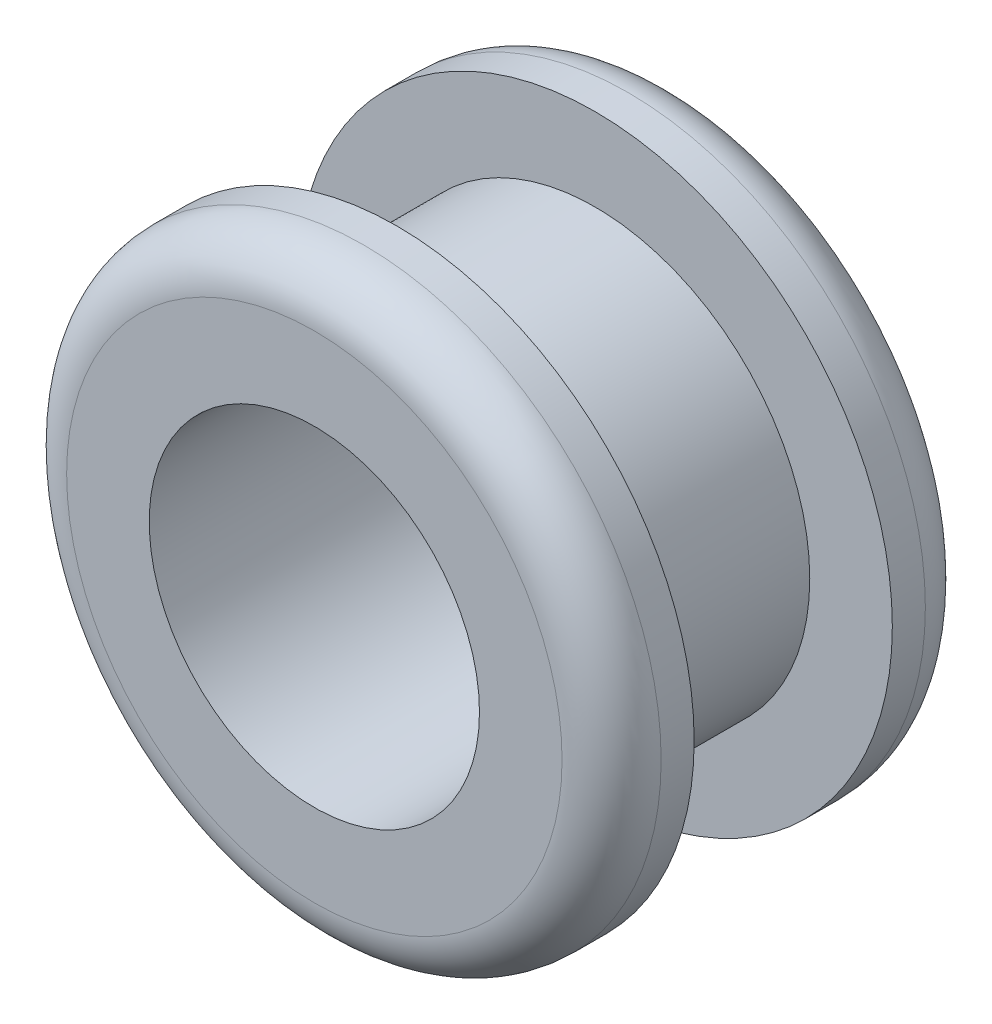
ISO-10303-21;
HEADER;
FILE_DESCRIPTION(('STEP AP214'),'2;1');
FILE_NAME('part.step','',(''),(''),'','','');
FILE_SCHEMA(('AUTOMOTIVE_DESIGN { 1 0 10303 214 1 1 1 1 }'));
ENDSEC;
DATA;
#1=APPLICATION_CONTEXT('core data for automotive mechanical design processes');
#2=APPLICATION_PROTOCOL_DEFINITION('international standard','automotive_design',2000,#1);
#3=PRODUCT_CONTEXT('',#1,'mechanical');
#4=PRODUCT('Part','Part','',(#3));
#5=PRODUCT_RELATED_PRODUCT_CATEGORY('part','',(#4));
#6=PRODUCT_DEFINITION_FORMATION('','',#4);
#7=PRODUCT_DEFINITION_CONTEXT('part definition',#1,'design');
#8=PRODUCT_DEFINITION('design','',#6,#7);
#9=PRODUCT_DEFINITION_SHAPE('','',#8);
#10=(LENGTH_UNIT() NAMED_UNIT(*) SI_UNIT(.MILLI.,.METRE.));
#11=(NAMED_UNIT(*) PLANE_ANGLE_UNIT() SI_UNIT($,.RADIAN.));
#12=(NAMED_UNIT(*) SI_UNIT($,.STERADIAN.) SOLID_ANGLE_UNIT());
#13=UNCERTAINTY_MEASURE_WITH_UNIT(LENGTH_MEASURE(1.E-05),#10,'distance_accuracy_value','');
#14=(GEOMETRIC_REPRESENTATION_CONTEXT(3) GLOBAL_UNCERTAINTY_ASSIGNED_CONTEXT((#13)) GLOBAL_UNIT_ASSIGNED_CONTEXT((#10,
#11,#12)) REPRESENTATION_CONTEXT('',''));
#15=CARTESIAN_POINT('',(0.,0.,0.));
#16=DIRECTION('',(0.,0.,1.));
#17=DIRECTION('',(1.,0.,0.));
#18=AXIS2_PLACEMENT_3D('',#15,#16,#17);
#19=CARTESIAN_POINT('',(0.,0.,-4.));
#20=DIRECTION('',(0.,0.,1.));
#21=DIRECTION('',(1.,0.,0.));
#22=AXIS2_PLACEMENT_3D('',#19,#20,#21);
#23=TOROIDAL_SURFACE('',#22,7.5,1.5);
#24=CARTESIAN_POINT('',(0.,0.,-4.));
#25=DIRECTION('',(0.,0.,-1.));
#26=DIRECTION('',(-1.,0.,0.));
#27=AXIS2_PLACEMENT_3D('',#24,#25,#26);
#28=CIRCLE('',#27,9.);
#29=CARTESIAN_POINT('',(9.,0.,-4.));
#30=VERTEX_POINT('',#29);
#31=CARTESIAN_POINT('',(-9.,0.,-4.));
#32=VERTEX_POINT('',#31);
#33=EDGE_CURVE('E11',#30,#32,#28,.T.);
#34=ORIENTED_EDGE('',*,*,#33,.T.);
#35=CARTESIAN_POINT('',(-7.5,0.,-4.));
#36=DIRECTION('',(0.,-1.,0.));
#37=DIRECTION('',(-1.,0.,0.));
#38=AXIS2_PLACEMENT_3D('',#35,#36,#37);
#39=CIRCLE('',#38,1.5);
#40=CARTESIAN_POINT('',(-7.5,0.,-5.5));
#41=VERTEX_POINT('',#40);
#42=EDGE_CURVE('E20',#32,#41,#39,.T.);
#43=ORIENTED_EDGE('',*,*,#42,.T.);
#44=CARTESIAN_POINT('',(0.,0.,-5.5));
#45=DIRECTION('',(0.,0.,1.));
#46=DIRECTION('',(-1.,0.,0.));
#47=AXIS2_PLACEMENT_3D('',#44,#45,#46);
#48=CIRCLE('',#47,7.5);
#49=CARTESIAN_POINT('',(7.5,0.,-5.5));
#50=VERTEX_POINT('',#49);
#51=EDGE_CURVE('E50',#41,#50,#48,.T.);
#52=ORIENTED_EDGE('',*,*,#51,.T.);
#53=CARTESIAN_POINT('',(0.,0.,-5.5));
#54=DIRECTION('',(0.,0.,1.));
#55=DIRECTION('',(-1.,0.,0.));
#56=AXIS2_PLACEMENT_3D('',#53,#54,#55);
#57=CIRCLE('',#56,7.5);
#58=EDGE_CURVE('E167',#50,#41,#57,.T.);
#59=ORIENTED_EDGE('',*,*,#58,.T.);
#60=ORIENTED_EDGE('',*,*,#42,.F.);
#61=CARTESIAN_POINT('',(0.,0.,-4.));
#62=DIRECTION('',(0.,0.,-1.));
#63=DIRECTION('',(-1.,0.,0.));
#64=AXIS2_PLACEMENT_3D('',#61,#62,#63);
#65=CIRCLE('',#64,9.);
#66=EDGE_CURVE('E38',#32,#30,#65,.T.);
#67=ORIENTED_EDGE('',*,*,#66,.T.);
#68=EDGE_LOOP('',(#34,#43,#52,#59,#60,#67));
#69=FACE_BOUND('',#68,.T.);
#70=ADVANCED_FACE('F16',(#69),#23,.T.);
#71=CARTESIAN_POINT('',(0.,0.,-5.5));
#72=DIRECTION('',(0.,0.,-1.));
#73=DIRECTION('',(1.,0.,0.));
#74=AXIS2_PLACEMENT_3D('',#71,#72,#73);
#75=CYLINDRICAL_SURFACE('',#74,9.);
#76=CARTESIAN_POINT('',(0.,0.,-3.));
#77=DIRECTION('',(0.,0.,-1.));
#78=DIRECTION('',(1.,0.,0.));
#79=AXIS2_PLACEMENT_3D('',#76,#77,#78);
#80=CIRCLE('',#79,9.);
#81=CARTESIAN_POINT('',(9.,0.,-3.));
#82=VERTEX_POINT('',#81);
#83=CARTESIAN_POINT('',(-9.,0.,-3.));
#84=VERTEX_POINT('',#83);
#85=EDGE_CURVE('E133',#82,#84,#80,.T.);
#86=ORIENTED_EDGE('',*,*,#85,.T.);
#87=DIRECTION('',(0.,0.,-1.));
#88=VECTOR('',#87,1.);
#89=CARTESIAN_POINT('',(-9.,0.,-5.5));
#90=LINE('',#89,#88);
#91=EDGE_CURVE('E131',#84,#32,#90,.T.);
#92=ORIENTED_EDGE('',*,*,#91,.T.);
#93=ORIENTED_EDGE('',*,*,#33,.F.);
#94=ORIENTED_EDGE('',*,*,#66,.F.);
#95=ORIENTED_EDGE('',*,*,#91,.F.);
#96=CARTESIAN_POINT('',(0.,0.,-3.));
#97=DIRECTION('',(0.,0.,-1.));
#98=DIRECTION('',(1.,0.,0.));
#99=AXIS2_PLACEMENT_3D('',#96,#97,#98);
#100=CIRCLE('',#99,9.);
#101=EDGE_CURVE('E134',#84,#82,#100,.T.);
#102=ORIENTED_EDGE('',*,*,#101,.T.);
#103=EDGE_LOOP('',(#86,#92,#93,#94,#95,#102));
#104=FACE_BOUND('',#103,.T.);
#105=ADVANCED_FACE('F186',(#104),#75,.T.);
#106=CARTESIAN_POINT('',(0.,0.,-5.5));
#107=DIRECTION('',(0.,0.,1.));
#108=DIRECTION('',(1.,0.,0.));
#109=AXIS2_PLACEMENT_3D('',#106,#107,#108);
#110=PLANE('',#109);
#111=ORIENTED_EDGE('',*,*,#58,.F.);
#112=ORIENTED_EDGE('',*,*,#51,.F.);
#113=EDGE_LOOP('',(#111,#112));
#114=FACE_BOUND('',#113,.T.);
#115=CARTESIAN_POINT('',(0.,0.,-5.5));
#116=DIRECTION('',(0.,0.,1.));
#117=DIRECTION('',(-1.,0.,0.));
#118=AXIS2_PLACEMENT_3D('',#115,#116,#117);
#119=CIRCLE('',#118,5.);
#120=CARTESIAN_POINT('',(5.,0.,-5.5));
#121=VERTEX_POINT('',#120);
#122=EDGE_CURVE('E136',#121,#121,#119,.T.);
#123=ORIENTED_EDGE('',*,*,#122,.T.);
#124=EDGE_LOOP('',(#123));
#125=FACE_BOUND('',#124,.T.);
#126=ADVANCED_FACE('F182',(#114,#125),#110,.F.);
#127=CARTESIAN_POINT('',(0.,0.,-3.));
#128=DIRECTION('',(0.,0.,1.));
#129=DIRECTION('',(1.,0.,0.));
#130=AXIS2_PLACEMENT_3D('',#127,#128,#129);
#131=PLANE('',#130);
#132=ORIENTED_EDGE('',*,*,#85,.F.);
#133=ORIENTED_EDGE('',*,*,#101,.F.);
#134=EDGE_LOOP('',(#132,#133));
#135=FACE_BOUND('',#134,.T.);
#136=CARTESIAN_POINT('',(0.,0.,-3.));
#137=DIRECTION('',(0.,0.,1.));
#138=DIRECTION('',(1.,0.,0.));
#139=AXIS2_PLACEMENT_3D('',#136,#137,#138);
#140=CIRCLE('',#139,6.5);
#141=CARTESIAN_POINT('',(6.5,0.,-3.));
#142=VERTEX_POINT('',#141);
#143=CARTESIAN_POINT('',(-6.5,0.,-3.));
#144=VERTEX_POINT('',#143);
#145=EDGE_CURVE('E112',#142,#144,#140,.T.);
#146=ORIENTED_EDGE('',*,*,#145,.F.);
#147=CARTESIAN_POINT('',(0.,0.,-3.));
#148=DIRECTION('',(0.,0.,1.));
#149=DIRECTION('',(1.,0.,0.));
#150=AXIS2_PLACEMENT_3D('',#147,#148,#149);
#151=CIRCLE('',#150,6.5);
#152=EDGE_CURVE('E123',#144,#142,#151,.T.);
#153=ORIENTED_EDGE('',*,*,#152,.F.);
#154=EDGE_LOOP('',(#146,#153));
#155=FACE_BOUND('',#154,.T.);
#156=ADVANCED_FACE('F185',(#135,#155),#131,.T.);
#157=CARTESIAN_POINT('',(0.,0.,4.));
#158=DIRECTION('',(0.,0.,1.));
#159=DIRECTION('',(1.,0.,0.));
#160=AXIS2_PLACEMENT_3D('',#157,#158,#159);
#161=TOROIDAL_SURFACE('',#160,7.5,1.5);
#162=CARTESIAN_POINT('',(0.,0.,5.5));
#163=DIRECTION('',(0.,0.,-1.));
#164=DIRECTION('',(-1.,0.,0.));
#165=AXIS2_PLACEMENT_3D('',#162,#163,#164);
#166=CIRCLE('',#165,7.5);
#167=CARTESIAN_POINT('',(7.5,0.,5.5));
#168=VERTEX_POINT('',#167);
#169=CARTESIAN_POINT('',(-7.5,0.,5.5));
#170=VERTEX_POINT('',#169);
#171=EDGE_CURVE('E140',#168,#170,#166,.T.);
#172=ORIENTED_EDGE('',*,*,#171,.T.);
#173=CARTESIAN_POINT('',(-7.5,0.,4.));
#174=DIRECTION('',(0.,-1.,0.));
#175=DIRECTION('',(-1.,0.,0.));
#176=AXIS2_PLACEMENT_3D('',#173,#174,#175);
#177=CIRCLE('',#176,1.5);
#178=CARTESIAN_POINT('',(-9.,0.,4.));
#179=VERTEX_POINT('',#178);
#180=EDGE_CURVE('E144',#170,#179,#177,.T.);
#181=ORIENTED_EDGE('',*,*,#180,.T.);
#182=CARTESIAN_POINT('',(0.,0.,4.));
#183=DIRECTION('',(0.,0.,1.));
#184=DIRECTION('',(-1.,0.,0.));
#185=AXIS2_PLACEMENT_3D('',#182,#183,#184);
#186=CIRCLE('',#185,9.);
#187=CARTESIAN_POINT('',(9.,0.,4.));
#188=VERTEX_POINT('',#187);
#189=EDGE_CURVE('E141',#179,#188,#186,.T.);
#190=ORIENTED_EDGE('',*,*,#189,.T.);
#191=CARTESIAN_POINT('',(0.,0.,4.));
#192=DIRECTION('',(0.,0.,1.));
#193=DIRECTION('',(-1.,0.,0.));
#194=AXIS2_PLACEMENT_3D('',#191,#192,#193);
#195=CIRCLE('',#194,9.);
#196=EDGE_CURVE('E145',#188,#179,#195,.T.);
#197=ORIENTED_EDGE('',*,*,#196,.T.);
#198=ORIENTED_EDGE('',*,*,#180,.F.);
#199=CARTESIAN_POINT('',(0.,0.,5.5));
#200=DIRECTION('',(0.,0.,-1.));
#201=DIRECTION('',(-1.,0.,0.));
#202=AXIS2_PLACEMENT_3D('',#199,#200,#201);
#203=CIRCLE('',#202,7.5);
#204=EDGE_CURVE('E153',#170,#168,#203,.T.);
#205=ORIENTED_EDGE('',*,*,#204,.T.);
#206=EDGE_LOOP('',(#172,#181,#190,#197,#198,#205));
#207=FACE_BOUND('',#206,.T.);
#208=ADVANCED_FACE('F221',(#207),#161,.T.);
#209=CARTESIAN_POINT('',(0.,0.,5.5));
#210=DIRECTION('',(0.,0.,-1.));
#211=DIRECTION('',(1.,0.,0.));
#212=AXIS2_PLACEMENT_3D('',#209,#210,#211);
#213=CYLINDRICAL_SURFACE('',#212,9.);
#214=CARTESIAN_POINT('',(0.,0.,3.));
#215=DIRECTION('',(0.,0.,-1.));
#216=DIRECTION('',(1.,0.,0.));
#217=AXIS2_PLACEMENT_3D('',#214,#215,#216);
#218=CIRCLE('',#217,9.);
#219=CARTESIAN_POINT('',(9.,0.,3.));
#220=VERTEX_POINT('',#219);
#221=CARTESIAN_POINT('',(-9.,0.,3.));
#222=VERTEX_POINT('',#221);
#223=EDGE_CURVE('E151',#220,#222,#218,.T.);
#224=ORIENTED_EDGE('',*,*,#223,.F.);
#225=CARTESIAN_POINT('',(0.,0.,3.));
#226=DIRECTION('',(0.,0.,-1.));
#227=DIRECTION('',(1.,0.,0.));
#228=AXIS2_PLACEMENT_3D('',#225,#226,#227);
#229=CIRCLE('',#228,9.);
#230=EDGE_CURVE('E158',#222,#220,#229,.T.);
#231=ORIENTED_EDGE('',*,*,#230,.F.);
#232=DIRECTION('',(0.,0.,1.));
#233=VECTOR('',#232,1.);
#234=CARTESIAN_POINT('',(-9.,0.,5.5));
#235=LINE('',#234,#233);
#236=EDGE_CURVE('E150',#222,#179,#235,.T.);
#237=ORIENTED_EDGE('',*,*,#236,.T.);
#238=ORIENTED_EDGE('',*,*,#196,.F.);
#239=ORIENTED_EDGE('',*,*,#189,.F.);
#240=ORIENTED_EDGE('',*,*,#236,.F.);
#241=EDGE_LOOP('',(#224,#231,#237,#238,#239,#240));
#242=FACE_BOUND('',#241,.T.);
#243=ADVANCED_FACE('F227',(#242),#213,.T.);
#244=CARTESIAN_POINT('',(0.,0.,5.5));
#245=DIRECTION('',(0.,0.,1.));
#246=DIRECTION('',(1.,0.,0.));
#247=AXIS2_PLACEMENT_3D('',#244,#245,#246);
#248=PLANE('',#247);
#249=ORIENTED_EDGE('',*,*,#171,.F.);
#250=ORIENTED_EDGE('',*,*,#204,.F.);
#251=EDGE_LOOP('',(#249,#250));
#252=FACE_BOUND('',#251,.T.);
#253=CARTESIAN_POINT('',(0.,0.,5.5));
#254=DIRECTION('',(0.,0.,-1.));
#255=DIRECTION('',(-1.,0.,0.));
#256=AXIS2_PLACEMENT_3D('',#253,#254,#255);
#257=CIRCLE('',#256,5.);
#258=CARTESIAN_POINT('',(5.,0.,5.5));
#259=VERTEX_POINT('',#258);
#260=EDGE_CURVE('E146',#259,#259,#257,.T.);
#261=ORIENTED_EDGE('',*,*,#260,.T.);
#262=EDGE_LOOP('',(#261));
#263=FACE_BOUND('',#262,.T.);
#264=ADVANCED_FACE('F18',(#252,#263),#248,.T.);
#265=CARTESIAN_POINT('',(0.,0.,3.));
#266=DIRECTION('',(0.,0.,1.));
#267=DIRECTION('',(1.,0.,0.));
#268=AXIS2_PLACEMENT_3D('',#265,#266,#267);
#269=PLANE('',#268);
#270=ORIENTED_EDGE('',*,*,#223,.T.);
#271=ORIENTED_EDGE('',*,*,#230,.T.);
#272=EDGE_LOOP('',(#270,#271));
#273=FACE_BOUND('',#272,.T.);
#274=CARTESIAN_POINT('',(0.,0.,3.));
#275=DIRECTION('',(0.,0.,-1.));
#276=DIRECTION('',(1.,0.,0.));
#277=AXIS2_PLACEMENT_3D('',#274,#275,#276);
#278=CIRCLE('',#277,6.5);
#279=CARTESIAN_POINT('',(6.5,0.,3.));
#280=VERTEX_POINT('',#279);
#281=CARTESIAN_POINT('',(-6.5,0.,3.));
#282=VERTEX_POINT('',#281);
#283=EDGE_CURVE('E108',#280,#282,#278,.T.);
#284=ORIENTED_EDGE('',*,*,#283,.F.);
#285=CARTESIAN_POINT('',(0.,0.,3.));
#286=DIRECTION('',(0.,0.,-1.));
#287=DIRECTION('',(1.,0.,0.));
#288=AXIS2_PLACEMENT_3D('',#285,#286,#287);
#289=CIRCLE('',#288,6.5);
#290=EDGE_CURVE('E105',#282,#280,#289,.T.);
#291=ORIENTED_EDGE('',*,*,#290,.F.);
#292=EDGE_LOOP('',(#284,#291));
#293=FACE_BOUND('',#292,.T.);
#294=ADVANCED_FACE('F107',(#273,#293),#269,.F.);
#295=CARTESIAN_POINT('',(0.,0.,0.));
#296=DIRECTION('',(0.,0.,1.));
#297=DIRECTION('',(-1.,0.,0.));
#298=AXIS2_PLACEMENT_3D('',#295,#296,#297);
#299=CYLINDRICAL_SURFACE('',#298,5.);
#300=ORIENTED_EDGE('',*,*,#260,.F.);
#301=DIRECTION('',(0.,0.,-1.));
#302=VECTOR('',#301,1.);
#303=CARTESIAN_POINT('',(5.,0.,0.));
#304=LINE('',#303,#302);
#305=EDGE_CURVE('E119',#259,#121,#304,.T.);
#306=ORIENTED_EDGE('',*,*,#305,.T.);
#307=ORIENTED_EDGE('',*,*,#122,.F.);
#308=ORIENTED_EDGE('',*,*,#305,.F.);
#309=EDGE_LOOP('',(#300,#306,#307,#308));
#310=FACE_BOUND('',#309,.T.);
#311=ADVANCED_FACE('F191',(#310),#299,.F.);
#312=CARTESIAN_POINT('',(0.,0.,0.));
#313=DIRECTION('',(0.,0.,1.));
#314=DIRECTION('',(1.,0.,0.));
#315=AXIS2_PLACEMENT_3D('',#312,#313,#314);
#316=CYLINDRICAL_SURFACE('',#315,6.5);
#317=ORIENTED_EDGE('',*,*,#283,.T.);
#318=DIRECTION('',(0.,0.,-1.));
#319=VECTOR('',#318,1.);
#320=CARTESIAN_POINT('',(-6.5,0.,0.));
#321=LINE('',#320,#319);
#322=EDGE_CURVE('E117',#282,#144,#321,.T.);
#323=ORIENTED_EDGE('',*,*,#322,.T.);
#324=ORIENTED_EDGE('',*,*,#152,.T.);
#325=ORIENTED_EDGE('',*,*,#145,.T.);
#326=ORIENTED_EDGE('',*,*,#322,.F.);
#327=ORIENTED_EDGE('',*,*,#290,.T.);
#328=EDGE_LOOP('',(#317,#323,#324,#325,#326,#327));
#329=FACE_BOUND('',#328,.T.);
#330=ADVANCED_FACE('F115',(#329),#316,.T.);
#331=CLOSED_SHELL('',(#70,#105,#126,#156,#208,#243,#264,#294,#311,#330));
#332=MANIFOLD_SOLID_BREP('B1',#331);
#333=ADVANCED_BREP_SHAPE_REPRESENTATION('',(#18,#332),#14);
#334=SHAPE_DEFINITION_REPRESENTATION(#9,#333);
ENDSEC;
END-ISO-10303-21;
